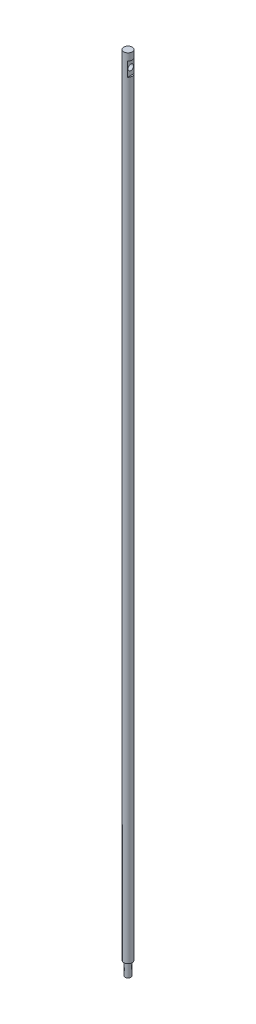
ISO-10303-21;
HEADER;
FILE_DESCRIPTION(('STEP AP214'),'2;1');
FILE_NAME('part.step','',(''),(''),'','','');
FILE_SCHEMA(('AUTOMOTIVE_DESIGN { 1 0 10303 214 1 1 1 1 }'));
ENDSEC;
DATA;
#1=APPLICATION_CONTEXT('core data for automotive mechanical design processes');
#2=APPLICATION_PROTOCOL_DEFINITION('international standard','automotive_design',2000,#1);
#3=PRODUCT_CONTEXT('',#1,'mechanical');
#4=PRODUCT('Part','Part','',(#3));
#5=PRODUCT_RELATED_PRODUCT_CATEGORY('part','',(#4));
#6=PRODUCT_DEFINITION_FORMATION('','',#4);
#7=PRODUCT_DEFINITION_CONTEXT('part definition',#1,'design');
#8=PRODUCT_DEFINITION('design','',#6,#7);
#9=PRODUCT_DEFINITION_SHAPE('','',#8);
#10=(LENGTH_UNIT() NAMED_UNIT(*) SI_UNIT(.MILLI.,.METRE.));
#11=(NAMED_UNIT(*) PLANE_ANGLE_UNIT() SI_UNIT($,.RADIAN.));
#12=(NAMED_UNIT(*) SI_UNIT($,.STERADIAN.) SOLID_ANGLE_UNIT());
#13=UNCERTAINTY_MEASURE_WITH_UNIT(LENGTH_MEASURE(1.E-05),#10,'distance_accuracy_value','');
#14=(GEOMETRIC_REPRESENTATION_CONTEXT(3) GLOBAL_UNCERTAINTY_ASSIGNED_CONTEXT((#13)) GLOBAL_UNIT_ASSIGNED_CONTEXT((#10,
#11,#12)) REPRESENTATION_CONTEXT('',''));
#15=CARTESIAN_POINT('',(0.,0.,0.));
#16=DIRECTION('',(0.,0.,1.));
#17=DIRECTION('',(1.,0.,0.));
#18=AXIS2_PLACEMENT_3D('',#15,#16,#17);
#19=CARTESIAN_POINT('',(0.,0.,0.));
#20=DIRECTION('',(0.,1.,0.));
#21=DIRECTION('',(0.,0.,1.));
#22=AXIS2_PLACEMENT_3D('',#19,#20,#21);
#23=PLANE('',#22);
#24=CARTESIAN_POINT('',(0.,0.,0.));
#25=DIRECTION('',(0.,1.,0.));
#26=DIRECTION('',(0.,0.,1.));
#27=AXIS2_PLACEMENT_3D('',#24,#25,#26);
#28=CIRCLE('',#27,3.);
#29=CARTESIAN_POINT('',(0.,0.,3.));
#30=VERTEX_POINT('',#29);
#31=EDGE_CURVE('E106',#30,#30,#28,.T.);
#32=ORIENTED_EDGE('',*,*,#31,.F.);
#33=EDGE_LOOP('',(#32));
#34=FACE_BOUND('',#33,.T.);
#35=CARTESIAN_POINT('',(0.,0.,0.));
#36=DIRECTION('',(0.,1.,0.));
#37=DIRECTION('',(0.,0.,1.));
#38=AXIS2_PLACEMENT_3D('',#35,#36,#37);
#39=CIRCLE('',#38,2.);
#40=CARTESIAN_POINT('',(0.,0.,2.));
#41=VERTEX_POINT('',#40);
#42=EDGE_CURVE('E103',#41,#41,#39,.F.);
#43=ORIENTED_EDGE('',*,*,#42,.F.);
#44=EDGE_LOOP('',(#43));
#45=FACE_BOUND('',#44,.T.);
#46=ADVANCED_FACE('F34',(#34,#45),#23,.F.);
#47=CARTESIAN_POINT('',(0.,540.,0.));
#48=DIRECTION('',(0.,-1.,0.));
#49=DIRECTION('',(0.,0.,-1.));
#50=AXIS2_PLACEMENT_3D('',#47,#48,#49);
#51=CYLINDRICAL_SURFACE('',#50,3.);
#52=DIRECTION('',(0.,-1.,0.));
#53=VECTOR('',#52,1.);
#54=CARTESIAN_POINT('',(2.00000000000001,540.,-2.23606797749978));
#55=LINE('',#54,#53);
#56=CARTESIAN_POINT('',(2.,555.,-2.23606797749979));
#57=VERTEX_POINT('',#56);
#58=CARTESIAN_POINT('',(2.,545.,-2.23606797749978));
#59=VERTEX_POINT('',#58);
#60=EDGE_CURVE('E43',#57,#59,#55,.T.);
#61=ORIENTED_EDGE('',*,*,#60,.T.);
#62=CARTESIAN_POINT('',(0.,545.,0.));
#63=DIRECTION('',(0.,-1.,0.));
#64=DIRECTION('',(0.,0.,-1.));
#65=AXIS2_PLACEMENT_3D('',#62,#63,#64);
#66=CIRCLE('',#65,3.);
#67=CARTESIAN_POINT('',(2.,545.,2.23606797749978));
#68=VERTEX_POINT('',#67);
#69=EDGE_CURVE('E11',#59,#68,#66,.T.);
#70=ORIENTED_EDGE('',*,*,#69,.T.);
#71=DIRECTION('',(0.,-1.,0.));
#72=VECTOR('',#71,1.);
#73=CARTESIAN_POINT('',(2.00000000000001,540.,2.23606797749978));
#74=LINE('',#73,#72);
#75=CARTESIAN_POINT('',(2.,555.,2.23606797749979));
#76=VERTEX_POINT('',#75);
#77=EDGE_CURVE('E79',#68,#76,#74,.F.);
#78=ORIENTED_EDGE('',*,*,#77,.T.);
#79=CARTESIAN_POINT('',(0.,555.,0.));
#80=DIRECTION('',(0.,1.,0.));
#81=DIRECTION('',(0.,0.,1.));
#82=AXIS2_PLACEMENT_3D('',#79,#80,#81);
#83=CIRCLE('',#82,3.);
#84=EDGE_CURVE('E74',#76,#57,#83,.T.);
#85=ORIENTED_EDGE('',*,*,#84,.T.);
#86=EDGE_LOOP('',(#61,#70,#78,#85));
#87=FACE_BOUND('',#86,.T.);
#88=DIRECTION('',(0.,-1.,0.));
#89=VECTOR('',#88,1.);
#90=CARTESIAN_POINT('',(-2.,540.,2.23606797749979));
#91=LINE('',#90,#89);
#92=CARTESIAN_POINT('',(-2.,555.,2.23606797749979));
#93=VERTEX_POINT('',#92);
#94=CARTESIAN_POINT('',(-2.,545.,2.23606797749979));
#95=VERTEX_POINT('',#94);
#96=EDGE_CURVE('E80',#93,#95,#91,.T.);
#97=ORIENTED_EDGE('',*,*,#96,.T.);
#98=CARTESIAN_POINT('',(0.,545.,0.));
#99=DIRECTION('',(0.,-1.,0.));
#100=DIRECTION('',(0.,0.,-1.));
#101=AXIS2_PLACEMENT_3D('',#98,#99,#100);
#102=CIRCLE('',#101,3.);
#103=CARTESIAN_POINT('',(-2.,545.,-2.23606797749979));
#104=VERTEX_POINT('',#103);
#105=EDGE_CURVE('E100',#95,#104,#102,.T.);
#106=ORIENTED_EDGE('',*,*,#105,.T.);
#107=DIRECTION('',(0.,-1.,0.));
#108=VECTOR('',#107,1.);
#109=CARTESIAN_POINT('',(-2.,540.,-2.23606797749979));
#110=LINE('',#109,#108);
#111=CARTESIAN_POINT('',(-2.,555.,-2.23606797749979));
#112=VERTEX_POINT('',#111);
#113=EDGE_CURVE('E97',#104,#112,#110,.F.);
#114=ORIENTED_EDGE('',*,*,#113,.T.);
#115=CARTESIAN_POINT('',(0.,555.,0.));
#116=DIRECTION('',(0.,1.,0.));
#117=DIRECTION('',(0.,0.,1.));
#118=AXIS2_PLACEMENT_3D('',#115,#116,#117);
#119=CIRCLE('',#118,3.);
#120=EDGE_CURVE('E94',#112,#93,#119,.T.);
#121=ORIENTED_EDGE('',*,*,#120,.T.);
#122=EDGE_LOOP('',(#97,#106,#114,#121));
#123=FACE_BOUND('',#122,.T.);
#124=ORIENTED_EDGE('',*,*,#31,.T.);
#125=EDGE_LOOP('',(#124));
#126=FACE_BOUND('',#125,.T.);
#127=CARTESIAN_POINT('',(0.,560.,0.));
#128=DIRECTION('',(0.,1.,0.));
#129=DIRECTION('',(0.,0.,1.));
#130=AXIS2_PLACEMENT_3D('',#127,#128,#129);
#131=CIRCLE('',#130,3.);
#132=CARTESIAN_POINT('',(0.,560.,3.));
#133=VERTEX_POINT('',#132);
#134=EDGE_CURVE('E112',#133,#133,#131,.T.);
#135=ORIENTED_EDGE('',*,*,#134,.F.);
#136=EDGE_LOOP('',(#135));
#137=FACE_BOUND('',#136,.T.);
#138=ADVANCED_FACE('F36',(#87,#123,#126,#137),#51,.T.);
#139=CARTESIAN_POINT('',(0.,-9.5,0.));
#140=DIRECTION('',(0.,1.,0.));
#141=DIRECTION('',(0.,0.,1.));
#142=AXIS2_PLACEMENT_3D('',#139,#140,#141);
#143=CYLINDRICAL_SURFACE('',#142,2.);
#144=CARTESIAN_POINT('',(0.,-9.5,0.));
#145=DIRECTION('',(0.,-1.,0.));
#146=DIRECTION('',(0.,0.,-1.));
#147=AXIS2_PLACEMENT_3D('',#144,#145,#146);
#148=CIRCLE('',#147,2.);
#149=CARTESIAN_POINT('',(0.,-9.5,-2.));
#150=VERTEX_POINT('',#149);
#151=EDGE_CURVE('E109',#150,#150,#148,.T.);
#152=ORIENTED_EDGE('',*,*,#151,.F.);
#153=EDGE_LOOP('',(#152));
#154=FACE_BOUND('',#153,.T.);
#155=ORIENTED_EDGE('',*,*,#42,.T.);
#156=EDGE_LOOP('',(#155));
#157=FACE_BOUND('',#156,.T.);
#158=ADVANCED_FACE('F141',(#154,#157),#143,.T.);
#159=CARTESIAN_POINT('',(0.,-9.5,0.));
#160=DIRECTION('',(0.,-1.,0.));
#161=DIRECTION('',(0.,0.,-1.));
#162=AXIS2_PLACEMENT_3D('',#159,#160,#161);
#163=PLANE('',#162);
#164=ORIENTED_EDGE('',*,*,#151,.T.);
#165=EDGE_LOOP('',(#164));
#166=FACE_BOUND('',#165,.T.);
#167=ADVANCED_FACE('F147',(#166),#163,.T.);
#168=CARTESIAN_POINT('',(0.,560.,0.));
#169=DIRECTION('',(0.,1.,0.));
#170=DIRECTION('',(0.,0.,1.));
#171=AXIS2_PLACEMENT_3D('',#168,#169,#170);
#172=PLANE('',#171);
#173=ORIENTED_EDGE('',*,*,#134,.T.);
#174=EDGE_LOOP('',(#173));
#175=FACE_BOUND('',#174,.T.);
#176=ADVANCED_FACE('F151',(#175),#172,.T.);
#177=CARTESIAN_POINT('',(-2.,555.,-5.));
#178=DIRECTION('',(0.,1.,0.));
#179=DIRECTION('',(0.,0.,1.));
#180=AXIS2_PLACEMENT_3D('',#177,#178,#179);
#181=PLANE('',#180);
#182=DIRECTION('',(0.,0.,1.));
#183=VECTOR('',#182,1.);
#184=CARTESIAN_POINT('',(-2.,555.,-5.));
#185=LINE('',#184,#183);
#186=EDGE_CURVE('E115',#112,#93,#185,.T.);
#187=ORIENTED_EDGE('',*,*,#186,.T.);
#188=ORIENTED_EDGE('',*,*,#120,.F.);
#189=EDGE_LOOP('',(#187,#188));
#190=FACE_BOUND('',#189,.T.);
#191=ADVANCED_FACE('F155',(#190),#181,.F.);
#192=CARTESIAN_POINT('',(-2.,545.,-5.));
#193=DIRECTION('',(1.,0.,0.));
#194=DIRECTION('',(0.,0.,-1.));
#195=AXIS2_PLACEMENT_3D('',#192,#193,#194);
#196=PLANE('',#195);
#197=CARTESIAN_POINT('',(-2.,550.,0.));
#198=DIRECTION('',(-1.,0.,0.));
#199=DIRECTION('',(0.,0.,1.));
#200=AXIS2_PLACEMENT_3D('',#197,#198,#199);
#201=CIRCLE('',#200,2.);
#202=CARTESIAN_POINT('',(-2.,550.,2.));
#203=VERTEX_POINT('',#202);
#204=EDGE_CURVE('E120',#203,#203,#201,.T.);
#205=ORIENTED_EDGE('',*,*,#204,.F.);
#206=EDGE_LOOP('',(#205));
#207=FACE_BOUND('',#206,.T.);
#208=ORIENTED_EDGE('',*,*,#186,.F.);
#209=ORIENTED_EDGE('',*,*,#113,.F.);
#210=DIRECTION('',(0.,0.,1.));
#211=VECTOR('',#210,1.);
#212=CARTESIAN_POINT('',(-2.,545.,-5.));
#213=LINE('',#212,#211);
#214=EDGE_CURVE('E56',#104,#95,#213,.T.);
#215=ORIENTED_EDGE('',*,*,#214,.T.);
#216=ORIENTED_EDGE('',*,*,#96,.F.);
#217=EDGE_LOOP('',(#208,#209,#215,#216));
#218=FACE_BOUND('',#217,.T.);
#219=ADVANCED_FACE('F159',(#207,#218),#196,.F.);
#220=CARTESIAN_POINT('',(-3.,545.,-5.));
#221=DIRECTION('',(0.,-1.,0.));
#222=DIRECTION('',(0.,0.,-1.));
#223=AXIS2_PLACEMENT_3D('',#220,#221,#222);
#224=PLANE('',#223);
#225=ORIENTED_EDGE('',*,*,#214,.F.);
#226=ORIENTED_EDGE('',*,*,#105,.F.);
#227=EDGE_LOOP('',(#225,#226));
#228=FACE_BOUND('',#227,.T.);
#229=ADVANCED_FACE('F161',(#228),#224,.F.);
#230=CARTESIAN_POINT('',(3.,545.,-5.));
#231=DIRECTION('',(0.,-1.,0.));
#232=DIRECTION('',(0.,0.,-1.));
#233=AXIS2_PLACEMENT_3D('',#230,#231,#232);
#234=PLANE('',#233);
#235=DIRECTION('',(0.,0.,1.));
#236=VECTOR('',#235,1.);
#237=CARTESIAN_POINT('',(2.,545.,-5.));
#238=LINE('',#237,#236);
#239=EDGE_CURVE('E86',#59,#68,#238,.T.);
#240=ORIENTED_EDGE('',*,*,#239,.T.);
#241=ORIENTED_EDGE('',*,*,#69,.F.);
#242=EDGE_LOOP('',(#240,#241));
#243=FACE_BOUND('',#242,.T.);
#244=ADVANCED_FACE('F164',(#243),#234,.F.);
#245=CARTESIAN_POINT('',(2.,545.,-5.));
#246=DIRECTION('',(-1.,0.,0.));
#247=DIRECTION('',(0.,-1.,0.));
#248=AXIS2_PLACEMENT_3D('',#245,#246,#247);
#249=PLANE('',#248);
#250=CARTESIAN_POINT('',(2.,550.,0.));
#251=DIRECTION('',(-1.,0.,0.));
#252=DIRECTION('',(0.,-1.,0.));
#253=AXIS2_PLACEMENT_3D('',#250,#251,#252);
#254=CIRCLE('',#253,2.);
#255=CARTESIAN_POINT('',(2.,548.,0.));
#256=VERTEX_POINT('',#255);
#257=EDGE_CURVE('E38',#256,#256,#254,.T.);
#258=ORIENTED_EDGE('',*,*,#257,.T.);
#259=EDGE_LOOP('',(#258));
#260=FACE_BOUND('',#259,.T.);
#261=DIRECTION('',(0.,0.,1.));
#262=VECTOR('',#261,1.);
#263=CARTESIAN_POINT('',(2.,555.,-5.));
#264=LINE('',#263,#262);
#265=EDGE_CURVE('E49',#57,#76,#264,.T.);
#266=ORIENTED_EDGE('',*,*,#265,.T.);
#267=ORIENTED_EDGE('',*,*,#77,.F.);
#268=ORIENTED_EDGE('',*,*,#239,.F.);
#269=ORIENTED_EDGE('',*,*,#60,.F.);
#270=EDGE_LOOP('',(#266,#267,#268,#269));
#271=FACE_BOUND('',#270,.T.);
#272=ADVANCED_FACE('F83',(#260,#271),#249,.F.);
#273=CARTESIAN_POINT('',(2.,555.,-5.));
#274=DIRECTION('',(0.,1.,0.));
#275=DIRECTION('',(0.,0.,1.));
#276=AXIS2_PLACEMENT_3D('',#273,#274,#275);
#277=PLANE('',#276);
#278=ORIENTED_EDGE('',*,*,#265,.F.);
#279=ORIENTED_EDGE('',*,*,#84,.F.);
#280=EDGE_LOOP('',(#278,#279));
#281=FACE_BOUND('',#280,.T.);
#282=ADVANCED_FACE('F75',(#281),#277,.F.);
#283=CARTESIAN_POINT('',(8.,550.,0.));
#284=DIRECTION('',(-1.,0.,0.));
#285=DIRECTION('',(0.,0.,1.));
#286=AXIS2_PLACEMENT_3D('',#283,#284,#285);
#287=CYLINDRICAL_SURFACE('',#286,2.);
#288=ORIENTED_EDGE('',*,*,#204,.T.);
#289=EDGE_LOOP('',(#288));
#290=FACE_BOUND('',#289,.T.);
#291=ORIENTED_EDGE('',*,*,#257,.F.);
#292=EDGE_LOOP('',(#291));
#293=FACE_BOUND('',#292,.T.);
#294=ADVANCED_FACE('F128',(#290,#293),#287,.F.);
#295=CLOSED_SHELL('',(#46,#138,#158,#167,#176,#191,#219,#229,#244,#272,#282,#294));
#296=MANIFOLD_SOLID_BREP('B2',#295);
#297=ADVANCED_BREP_SHAPE_REPRESENTATION('',(#18,#296),#14);
#298=SHAPE_DEFINITION_REPRESENTATION(#9,#297);
ENDSEC;
END-ISO-10303-21;
